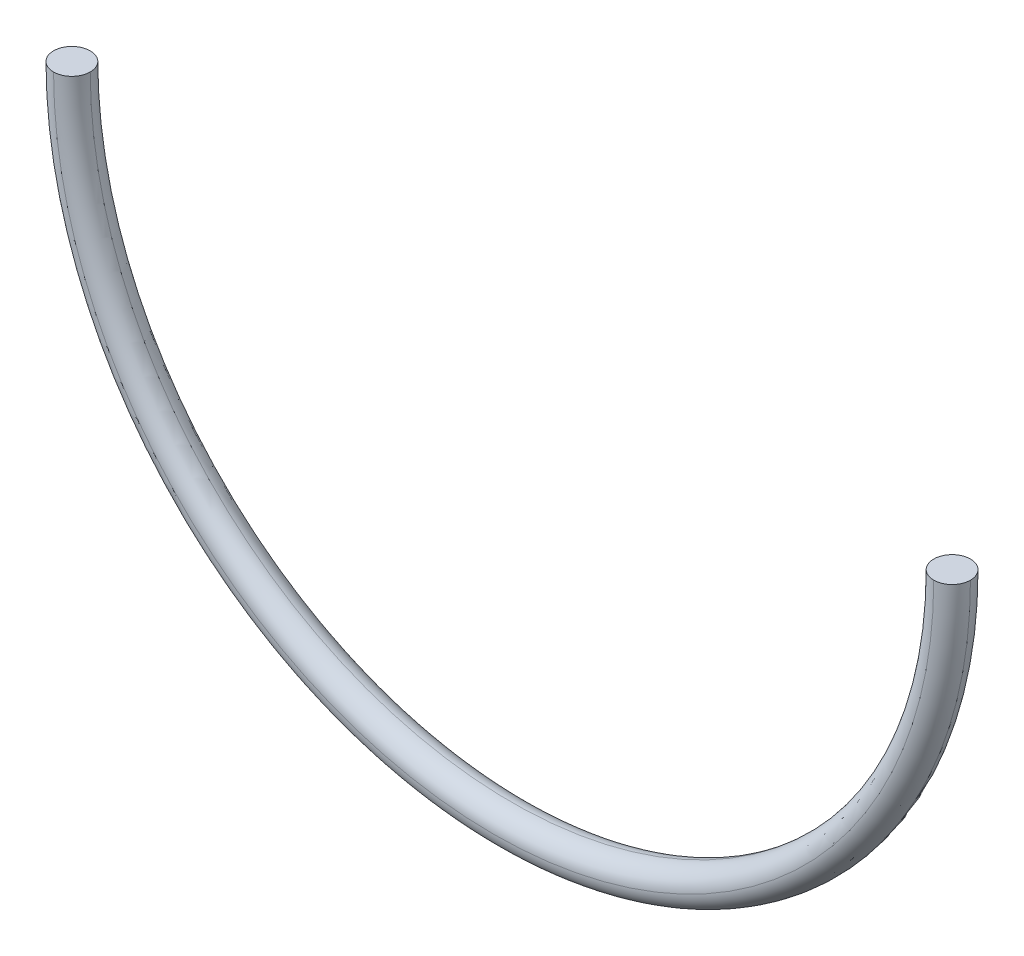
ISO-10303-21;
HEADER;
FILE_DESCRIPTION(('STEP AP214'),'2;1');
FILE_NAME('part.step','',(''),(''),'','','');
FILE_SCHEMA(('AUTOMOTIVE_DESIGN { 1 0 10303 214 1 1 1 1 }'));
ENDSEC;
DATA;
#1=APPLICATION_CONTEXT('core data for automotive mechanical design processes');
#2=APPLICATION_PROTOCOL_DEFINITION('international standard','automotive_design',2000,#1);
#3=PRODUCT_CONTEXT('',#1,'mechanical');
#4=PRODUCT('Part','Part','',(#3));
#5=PRODUCT_RELATED_PRODUCT_CATEGORY('part','',(#4));
#6=PRODUCT_DEFINITION_FORMATION('','',#4);
#7=PRODUCT_DEFINITION_CONTEXT('part definition',#1,'design');
#8=PRODUCT_DEFINITION('design','',#6,#7);
#9=PRODUCT_DEFINITION_SHAPE('','',#8);
#10=(LENGTH_UNIT() NAMED_UNIT(*) SI_UNIT(.MILLI.,.METRE.));
#11=(NAMED_UNIT(*) PLANE_ANGLE_UNIT() SI_UNIT($,.RADIAN.));
#12=(NAMED_UNIT(*) SI_UNIT($,.STERADIAN.) SOLID_ANGLE_UNIT());
#13=UNCERTAINTY_MEASURE_WITH_UNIT(LENGTH_MEASURE(1.E-05),#10,'distance_accuracy_value','');
#14=(GEOMETRIC_REPRESENTATION_CONTEXT(3) GLOBAL_UNCERTAINTY_ASSIGNED_CONTEXT((#13)) GLOBAL_UNIT_ASSIGNED_CONTEXT((#10,
#11,#12)) REPRESENTATION_CONTEXT('',''));
#15=CARTESIAN_POINT('',(0.,0.,0.));
#16=DIRECTION('',(0.,0.,1.));
#17=DIRECTION('',(1.,0.,0.));
#18=AXIS2_PLACEMENT_3D('',#15,#16,#17);
#19=CARTESIAN_POINT('',(0.,0.,-6.));
#20=DIRECTION('',(0.,1.,0.));
#21=DIRECTION('',(-1.,0.,0.));
#22=AXIS2_PLACEMENT_3D('',#19,#20,#21);
#23=PLANE('',#22);
#24=CARTESIAN_POINT('',(72.,0.,-3.));
#25=DIRECTION('',(0.,1.,0.));
#26=DIRECTION('',(-1.,0.,0.));
#27=AXIS2_PLACEMENT_3D('',#24,#25,#26);
#28=CIRCLE('',#27,3.);
#29=CARTESIAN_POINT('',(75.,0.,-3.));
#30=VERTEX_POINT('',#29);
#31=CARTESIAN_POINT('',(72.,0.,-6.));
#32=VERTEX_POINT('',#31);
#33=EDGE_CURVE('E95',#30,#32,#28,.T.);
#34=ORIENTED_EDGE('',*,*,#33,.T.);
#35=CARTESIAN_POINT('',(72.,0.,-3.));
#36=DIRECTION('',(0.,1.,0.));
#37=DIRECTION('',(-1.,0.,0.));
#38=AXIS2_PLACEMENT_3D('',#35,#36,#37);
#39=CIRCLE('',#38,3.);
#40=CARTESIAN_POINT('',(69.,0.,-3.));
#41=VERTEX_POINT('',#40);
#42=EDGE_CURVE('E90',#32,#41,#39,.T.);
#43=ORIENTED_EDGE('',*,*,#42,.T.);
#44=CARTESIAN_POINT('',(72.,0.,-3.));
#45=DIRECTION('',(0.,1.,0.));
#46=DIRECTION('',(-1.,0.,0.));
#47=AXIS2_PLACEMENT_3D('',#44,#45,#46);
#48=CIRCLE('',#47,3.);
#49=CARTESIAN_POINT('',(72.,0.,0.));
#50=VERTEX_POINT('',#49);
#51=EDGE_CURVE('E86',#41,#50,#48,.T.);
#52=ORIENTED_EDGE('',*,*,#51,.T.);
#53=CARTESIAN_POINT('',(72.,0.,-3.));
#54=DIRECTION('',(0.,1.,0.));
#55=DIRECTION('',(-1.,0.,0.));
#56=AXIS2_PLACEMENT_3D('',#53,#54,#55);
#57=CIRCLE('',#56,3.);
#58=EDGE_CURVE('E88',#50,#30,#57,.T.);
#59=ORIENTED_EDGE('',*,*,#58,.T.);
#60=EDGE_LOOP('',(#34,#43,#52,#59));
#61=FACE_BOUND('',#60,.T.);
#62=ADVANCED_FACE('F41',(#61),#23,.T.);
#63=CARTESIAN_POINT('',(0.,0.,-6.));
#64=DIRECTION('',(0.,-1.,0.));
#65=DIRECTION('',(0.,0.,-1.));
#66=AXIS2_PLACEMENT_3D('',#63,#64,#65);
#67=PLANE('',#66);
#68=CARTESIAN_POINT('',(-72.,0.,-3.));
#69=DIRECTION('',(0.,-1.,0.));
#70=DIRECTION('',(0.,0.,-1.));
#71=AXIS2_PLACEMENT_3D('',#68,#69,#70);
#72=CIRCLE('',#71,3.);
#73=CARTESIAN_POINT('',(-72.,0.,0.));
#74=VERTEX_POINT('',#73);
#75=CARTESIAN_POINT('',(-69.,0.,-3.));
#76=VERTEX_POINT('',#75);
#77=EDGE_CURVE('E51',#74,#76,#72,.F.);
#78=ORIENTED_EDGE('',*,*,#77,.T.);
#79=CARTESIAN_POINT('',(-72.,0.,-3.));
#80=DIRECTION('',(0.,-1.,0.));
#81=DIRECTION('',(0.,0.,-1.));
#82=AXIS2_PLACEMENT_3D('',#79,#80,#81);
#83=CIRCLE('',#82,3.);
#84=CARTESIAN_POINT('',(-72.,0.,-6.));
#85=VERTEX_POINT('',#84);
#86=EDGE_CURVE('E11',#76,#85,#83,.F.);
#87=ORIENTED_EDGE('',*,*,#86,.T.);
#88=CARTESIAN_POINT('',(-72.,0.,-3.));
#89=DIRECTION('',(0.,-1.,0.));
#90=DIRECTION('',(0.,0.,-1.));
#91=AXIS2_PLACEMENT_3D('',#88,#89,#90);
#92=CIRCLE('',#91,3.);
#93=CARTESIAN_POINT('',(-75.,0.,-3.));
#94=VERTEX_POINT('',#93);
#95=EDGE_CURVE('E58',#85,#94,#92,.F.);
#96=ORIENTED_EDGE('',*,*,#95,.T.);
#97=CARTESIAN_POINT('',(-72.,0.,-3.));
#98=DIRECTION('',(0.,-1.,0.));
#99=DIRECTION('',(0.,0.,-1.));
#100=AXIS2_PLACEMENT_3D('',#97,#98,#99);
#101=CIRCLE('',#100,3.);
#102=EDGE_CURVE('E119',#94,#74,#101,.F.);
#103=ORIENTED_EDGE('',*,*,#102,.T.);
#104=EDGE_LOOP('',(#78,#87,#96,#103));
#105=FACE_BOUND('',#104,.T.);
#106=ADVANCED_FACE('F127',(#105),#67,.F.);
#107=CARTESIAN_POINT('',(0.,0.,-3.));
#108=DIRECTION('',(0.,0.,1.));
#109=DIRECTION('',(1.,0.,0.));
#110=AXIS2_PLACEMENT_3D('',#107,#108,#109);
#111=TOROIDAL_SURFACE('',#110,72.,3.);
#112=CARTESIAN_POINT('',(0.,0.,-3.));
#113=DIRECTION('',(0.,0.,1.));
#114=DIRECTION('',(1.,0.,0.));
#115=AXIS2_PLACEMENT_3D('',#112,#113,#114);
#116=CIRCLE('',#115,75.);
#117=EDGE_CURVE('E101',#30,#94,#116,.F.);
#118=ORIENTED_EDGE('',*,*,#117,.F.);
#119=ORIENTED_EDGE('',*,*,#58,.F.);
#120=CARTESIAN_POINT('',(0.,0.,0.));
#121=DIRECTION('',(0.,0.,1.));
#122=DIRECTION('',(1.,0.,0.));
#123=AXIS2_PLACEMENT_3D('',#120,#121,#122);
#124=CIRCLE('',#123,72.);
#125=EDGE_CURVE('E45',#74,#50,#124,.T.);
#126=ORIENTED_EDGE('',*,*,#125,.F.);
#127=ORIENTED_EDGE('',*,*,#102,.F.);
#128=EDGE_LOOP('',(#118,#119,#126,#127));
#129=FACE_BOUND('',#128,.T.);
#130=ADVANCED_FACE('F43',(#129),#111,.T.);
#131=CARTESIAN_POINT('',(0.,0.,-3.));
#132=DIRECTION('',(0.,0.,1.));
#133=DIRECTION('',(1.,0.,0.));
#134=AXIS2_PLACEMENT_3D('',#131,#132,#133);
#135=TOROIDAL_SURFACE('',#134,72.,3.);
#136=ORIENTED_EDGE('',*,*,#125,.T.);
#137=ORIENTED_EDGE('',*,*,#51,.F.);
#138=CARTESIAN_POINT('',(0.,0.,-3.));
#139=DIRECTION('',(0.,0.,1.));
#140=DIRECTION('',(1.,0.,0.));
#141=AXIS2_PLACEMENT_3D('',#138,#139,#140);
#142=CIRCLE('',#141,69.);
#143=EDGE_CURVE('E108',#76,#41,#142,.T.);
#144=ORIENTED_EDGE('',*,*,#143,.F.);
#145=ORIENTED_EDGE('',*,*,#77,.F.);
#146=EDGE_LOOP('',(#136,#137,#144,#145));
#147=FACE_BOUND('',#146,.T.);
#148=ADVANCED_FACE('F105',(#147),#135,.T.);
#149=CARTESIAN_POINT('',(0.,0.,-3.));
#150=DIRECTION('',(0.,0.,1.));
#151=DIRECTION('',(1.,0.,0.));
#152=AXIS2_PLACEMENT_3D('',#149,#150,#151);
#153=TOROIDAL_SURFACE('',#152,72.,3.);
#154=ORIENTED_EDGE('',*,*,#117,.T.);
#155=ORIENTED_EDGE('',*,*,#95,.F.);
#156=CARTESIAN_POINT('',(0.,0.,-6.));
#157=DIRECTION('',(0.,0.,1.));
#158=DIRECTION('',(1.,0.,0.));
#159=AXIS2_PLACEMENT_3D('',#156,#157,#158);
#160=CIRCLE('',#159,72.);
#161=EDGE_CURVE('E66',#32,#85,#160,.F.);
#162=ORIENTED_EDGE('',*,*,#161,.F.);
#163=ORIENTED_EDGE('',*,*,#33,.F.);
#164=EDGE_LOOP('',(#154,#155,#162,#163));
#165=FACE_BOUND('',#164,.T.);
#166=ADVANCED_FACE('F125',(#165),#153,.T.);
#167=CARTESIAN_POINT('',(0.,0.,-3.));
#168=DIRECTION('',(0.,0.,1.));
#169=DIRECTION('',(1.,0.,0.));
#170=AXIS2_PLACEMENT_3D('',#167,#168,#169);
#171=TOROIDAL_SURFACE('',#170,72.,3.);
#172=ORIENTED_EDGE('',*,*,#86,.F.);
#173=ORIENTED_EDGE('',*,*,#143,.T.);
#174=ORIENTED_EDGE('',*,*,#42,.F.);
#175=ORIENTED_EDGE('',*,*,#161,.T.);
#176=EDGE_LOOP('',(#172,#173,#174,#175));
#177=FACE_BOUND('',#176,.T.);
#178=ADVANCED_FACE('F126',(#177),#171,.T.);
#179=CLOSED_SHELL('',(#62,#106,#130,#148,#166,#178));
#180=MANIFOLD_SOLID_BREP('B2',#179);
#181=ADVANCED_BREP_SHAPE_REPRESENTATION('',(#18,#180),#14);
#182=SHAPE_DEFINITION_REPRESENTATION(#9,#181);
ENDSEC;
END-ISO-10303-21;
